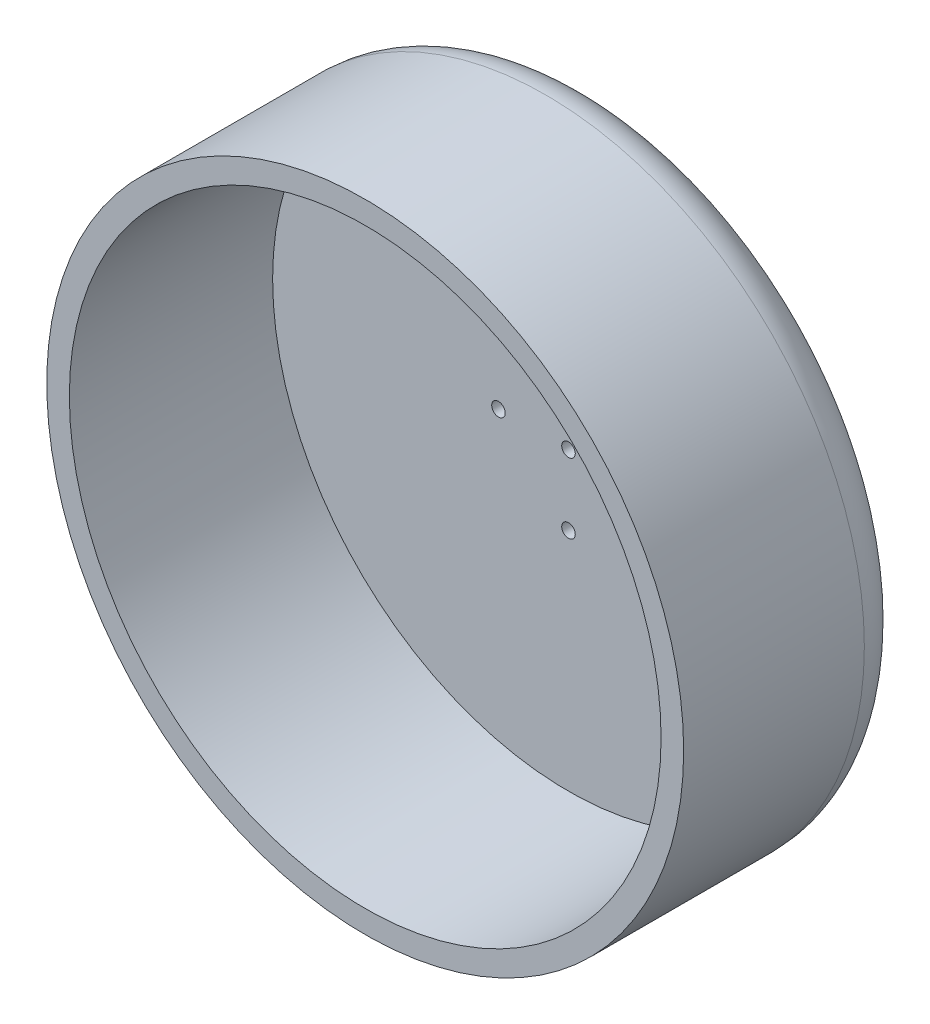
ISO-10303-21;
HEADER;
FILE_DESCRIPTION(('STEP AP214'),'2;1');
FILE_NAME('part.step','',(''),(''),'','','');
FILE_SCHEMA(('AUTOMOTIVE_DESIGN { 1 0 10303 214 1 1 1 1 }'));
ENDSEC;
DATA;
#1=APPLICATION_CONTEXT('core data for automotive mechanical design processes');
#2=APPLICATION_PROTOCOL_DEFINITION('international standard','automotive_design',2000,#1);
#3=PRODUCT_CONTEXT('',#1,'mechanical');
#4=PRODUCT('Part','Part','',(#3));
#5=PRODUCT_RELATED_PRODUCT_CATEGORY('part','',(#4));
#6=PRODUCT_DEFINITION_FORMATION('','',#4);
#7=PRODUCT_DEFINITION_CONTEXT('part definition',#1,'design');
#8=PRODUCT_DEFINITION('design','',#6,#7);
#9=PRODUCT_DEFINITION_SHAPE('','',#8);
#10=(LENGTH_UNIT() NAMED_UNIT(*) SI_UNIT(.MILLI.,.METRE.));
#11=(NAMED_UNIT(*) PLANE_ANGLE_UNIT() SI_UNIT($,.RADIAN.));
#12=(NAMED_UNIT(*) SI_UNIT($,.STERADIAN.) SOLID_ANGLE_UNIT());
#13=UNCERTAINTY_MEASURE_WITH_UNIT(LENGTH_MEASURE(1.E-05),#10,'distance_accuracy_value','');
#14=(GEOMETRIC_REPRESENTATION_CONTEXT(3) GLOBAL_UNCERTAINTY_ASSIGNED_CONTEXT((#13)) GLOBAL_UNIT_ASSIGNED_CONTEXT((#10,
#11,#12)) REPRESENTATION_CONTEXT('',''));
#15=CARTESIAN_POINT('',(0.,0.,0.));
#16=DIRECTION('',(0.,0.,1.));
#17=DIRECTION('',(1.,0.,0.));
#18=AXIS2_PLACEMENT_3D('',#15,#16,#17);
#19=CARTESIAN_POINT('',(0.,0.,5.));
#20=DIRECTION('',(0.,0.,1.));
#21=DIRECTION('',(1.,0.,0.));
#22=AXIS2_PLACEMENT_3D('',#19,#20,#21);
#23=PLANE('',#22);
#24=CARTESIAN_POINT('',(0.,0.,5.));
#25=DIRECTION('',(0.,0.,1.));
#26=DIRECTION('',(1.,0.,0.));
#27=AXIS2_PLACEMENT_3D('',#24,#25,#26);
#28=CIRCLE('',#27,1.5);
#29=CARTESIAN_POINT('',(1.5,0.,5.));
#30=VERTEX_POINT('',#29);
#31=EDGE_CURVE('E69',#30,#30,#28,.T.);
#32=ORIENTED_EDGE('',*,*,#31,.F.);
#33=EDGE_LOOP('',(#32));
#34=FACE_BOUND('',#33,.T.);
#35=CARTESIAN_POINT('',(0.,15.5,5.));
#36=DIRECTION('',(0.,0.,1.));
#37=DIRECTION('',(1.,0.,0.));
#38=AXIS2_PLACEMENT_3D('',#35,#36,#37);
#39=CIRCLE('',#38,1.5);
#40=CARTESIAN_POINT('',(1.5,15.5,5.));
#41=VERTEX_POINT('',#40);
#42=EDGE_CURVE('E97',#41,#41,#39,.T.);
#43=ORIENTED_EDGE('',*,*,#42,.F.);
#44=EDGE_LOOP('',(#43));
#45=FACE_BOUND('',#44,.T.);
#46=CARTESIAN_POINT('',(15.5,0.,5.));
#47=DIRECTION('',(0.,0.,1.));
#48=DIRECTION('',(1.,0.,0.));
#49=AXIS2_PLACEMENT_3D('',#46,#47,#48);
#50=CIRCLE('',#49,1.5);
#51=CARTESIAN_POINT('',(17.,0.,5.));
#52=VERTEX_POINT('',#51);
#53=EDGE_CURVE('E101',#52,#52,#50,.T.);
#54=ORIENTED_EDGE('',*,*,#53,.F.);
#55=EDGE_LOOP('',(#54));
#56=FACE_BOUND('',#55,.T.);
#57=CARTESIAN_POINT('',(-1.08235921504137E-13,-15.5,5.));
#58=DIRECTION('',(0.,0.,1.));
#59=DIRECTION('',(1.,0.,0.));
#60=AXIS2_PLACEMENT_3D('',#57,#58,#59);
#61=CIRCLE('',#60,1.5);
#62=CARTESIAN_POINT('',(1.49999999999989,-15.5,5.));
#63=VERTEX_POINT('',#62);
#64=EDGE_CURVE('E105',#63,#63,#61,.T.);
#65=ORIENTED_EDGE('',*,*,#64,.F.);
#66=EDGE_LOOP('',(#65));
#67=FACE_BOUND('',#66,.T.);
#68=CARTESIAN_POINT('',(-15.5,1.62353882256206E-13,5.));
#69=DIRECTION('',(0.,0.,1.));
#70=DIRECTION('',(1.,0.,0.));
#71=AXIS2_PLACEMENT_3D('',#68,#69,#70);
#72=CIRCLE('',#71,1.5);
#73=CARTESIAN_POINT('',(-14.,1.62353882256206E-13,5.));
#74=VERTEX_POINT('',#73);
#75=EDGE_CURVE('E76',#74,#74,#72,.T.);
#76=ORIENTED_EDGE('',*,*,#75,.F.);
#77=EDGE_LOOP('',(#76));
#78=FACE_BOUND('',#77,.T.);
#79=CARTESIAN_POINT('',(0.,0.,5.));
#80=DIRECTION('',(0.,0.,1.));
#81=DIRECTION('',(1.,0.,0.));
#82=AXIS2_PLACEMENT_3D('',#79,#80,#81);
#83=CIRCLE('',#82,65.5);
#84=CARTESIAN_POINT('',(65.5,0.,5.));
#85=VERTEX_POINT('',#84);
#86=EDGE_CURVE('E64',#85,#85,#83,.F.);
#87=ORIENTED_EDGE('',*,*,#86,.F.);
#88=EDGE_LOOP('',(#87));
#89=FACE_BOUND('',#88,.T.);
#90=ADVANCED_FACE('F51',(#34,#45,#56,#67,#78,#89),#23,.T.);
#91=CARTESIAN_POINT('',(0.,15.5,5.));
#92=DIRECTION('',(0.,0.,-1.));
#93=DIRECTION('',(-1.,0.,0.));
#94=AXIS2_PLACEMENT_3D('',#91,#92,#93);
#95=CYLINDRICAL_SURFACE('',#94,1.5);
#96=ORIENTED_EDGE('',*,*,#42,.T.);
#97=EDGE_LOOP('',(#96));
#98=FACE_BOUND('',#97,.T.);
#99=CARTESIAN_POINT('',(0.,15.5,0.));
#100=DIRECTION('',(0.,0.,1.));
#101=DIRECTION('',(1.,0.,0.));
#102=AXIS2_PLACEMENT_3D('',#99,#100,#101);
#103=CIRCLE('',#102,1.5);
#104=CARTESIAN_POINT('',(1.5,15.5,0.));
#105=VERTEX_POINT('',#104);
#106=EDGE_CURVE('E77',#105,#105,#103,.T.);
#107=ORIENTED_EDGE('',*,*,#106,.F.);
#108=EDGE_LOOP('',(#107));
#109=FACE_BOUND('',#108,.T.);
#110=ADVANCED_FACE('F137',(#98,#109),#95,.F.);
#111=CARTESIAN_POINT('',(15.5,0.,5.));
#112=DIRECTION('',(0.,0.,-1.));
#113=DIRECTION('',(-1.,0.,0.));
#114=AXIS2_PLACEMENT_3D('',#111,#112,#113);
#115=CYLINDRICAL_SURFACE('',#114,1.5);
#116=ORIENTED_EDGE('',*,*,#53,.T.);
#117=EDGE_LOOP('',(#116));
#118=FACE_BOUND('',#117,.T.);
#119=CARTESIAN_POINT('',(15.5,0.,0.));
#120=DIRECTION('',(0.,0.,1.));
#121=DIRECTION('',(1.,0.,0.));
#122=AXIS2_PLACEMENT_3D('',#119,#120,#121);
#123=CIRCLE('',#122,1.5);
#124=CARTESIAN_POINT('',(17.,0.,0.));
#125=VERTEX_POINT('',#124);
#126=EDGE_CURVE('E81',#125,#125,#123,.T.);
#127=ORIENTED_EDGE('',*,*,#126,.F.);
#128=EDGE_LOOP('',(#127));
#129=FACE_BOUND('',#128,.T.);
#130=ADVANCED_FACE('F143',(#118,#129),#115,.F.);
#131=CARTESIAN_POINT('',(-1.08235921504137E-13,-15.5,5.));
#132=DIRECTION('',(0.,0.,-1.));
#133=DIRECTION('',(-1.,0.,0.));
#134=AXIS2_PLACEMENT_3D('',#131,#132,#133);
#135=CYLINDRICAL_SURFACE('',#134,1.5);
#136=ORIENTED_EDGE('',*,*,#64,.T.);
#137=EDGE_LOOP('',(#136));
#138=FACE_BOUND('',#137,.T.);
#139=CARTESIAN_POINT('',(-1.08235921504137E-13,-15.5,0.));
#140=DIRECTION('',(0.,0.,1.));
#141=DIRECTION('',(1.,0.,0.));
#142=AXIS2_PLACEMENT_3D('',#139,#140,#141);
#143=CIRCLE('',#142,1.5);
#144=CARTESIAN_POINT('',(1.49999999999989,-15.5,0.));
#145=VERTEX_POINT('',#144);
#146=EDGE_CURVE('E85',#145,#145,#143,.T.);
#147=ORIENTED_EDGE('',*,*,#146,.F.);
#148=EDGE_LOOP('',(#147));
#149=FACE_BOUND('',#148,.T.);
#150=ADVANCED_FACE('F154',(#138,#149),#135,.F.);
#151=CARTESIAN_POINT('',(-15.5,1.62353882256206E-13,5.));
#152=DIRECTION('',(0.,0.,-1.));
#153=DIRECTION('',(-1.,0.,0.));
#154=AXIS2_PLACEMENT_3D('',#151,#152,#153);
#155=CYLINDRICAL_SURFACE('',#154,1.5);
#156=ORIENTED_EDGE('',*,*,#75,.T.);
#157=EDGE_LOOP('',(#156));
#158=FACE_BOUND('',#157,.T.);
#159=CARTESIAN_POINT('',(-15.5,1.62353882256206E-13,0.));
#160=DIRECTION('',(0.,0.,1.));
#161=DIRECTION('',(1.,0.,0.));
#162=AXIS2_PLACEMENT_3D('',#159,#160,#161);
#163=CIRCLE('',#162,1.5);
#164=CARTESIAN_POINT('',(-14.,1.62353882256206E-13,0.));
#165=VERTEX_POINT('',#164);
#166=EDGE_CURVE('E89',#165,#165,#163,.T.);
#167=ORIENTED_EDGE('',*,*,#166,.F.);
#168=EDGE_LOOP('',(#167));
#169=FACE_BOUND('',#168,.T.);
#170=ADVANCED_FACE('F158',(#158,#169),#155,.F.);
#171=CARTESIAN_POINT('',(0.,0.,5.));
#172=DIRECTION('',(0.,0.,-1.));
#173=DIRECTION('',(-1.,0.,0.));
#174=AXIS2_PLACEMENT_3D('',#171,#172,#173);
#175=CYLINDRICAL_SURFACE('',#174,70.5);
#176=CARTESIAN_POINT('',(0.,0.,10.));
#177=DIRECTION('',(0.,0.,1.));
#178=DIRECTION('',(1.,0.,0.));
#179=AXIS2_PLACEMENT_3D('',#176,#177,#178);
#180=CIRCLE('',#179,70.5);
#181=CARTESIAN_POINT('',(70.5,0.,10.));
#182=VERTEX_POINT('',#181);
#183=EDGE_CURVE('E59',#182,#182,#180,.T.);
#184=ORIENTED_EDGE('',*,*,#183,.T.);
#185=EDGE_LOOP('',(#184));
#186=FACE_BOUND('',#185,.T.);
#187=CARTESIAN_POINT('',(0.,0.,50.));
#188=DIRECTION('',(0.,0.,1.));
#189=DIRECTION('',(1.,0.,0.));
#190=AXIS2_PLACEMENT_3D('',#187,#188,#189);
#191=CIRCLE('',#190,70.5);
#192=CARTESIAN_POINT('',(70.5,0.,50.));
#193=VERTEX_POINT('',#192);
#194=EDGE_CURVE('E93',#193,#193,#191,.T.);
#195=ORIENTED_EDGE('',*,*,#194,.F.);
#196=EDGE_LOOP('',(#195));
#197=FACE_BOUND('',#196,.T.);
#198=ADVANCED_FACE('F149',(#186,#197),#175,.T.);
#199=CARTESIAN_POINT('',(0.,0.,5.));
#200=DIRECTION('',(0.,0.,-1.));
#201=DIRECTION('',(-1.,0.,0.));
#202=AXIS2_PLACEMENT_3D('',#199,#200,#201);
#203=CYLINDRICAL_SURFACE('',#202,1.5);
#204=ORIENTED_EDGE('',*,*,#31,.T.);
#205=EDGE_LOOP('',(#204));
#206=FACE_BOUND('',#205,.T.);
#207=CARTESIAN_POINT('',(0.,0.,0.));
#208=DIRECTION('',(0.,0.,1.));
#209=DIRECTION('',(1.,0.,0.));
#210=AXIS2_PLACEMENT_3D('',#207,#208,#209);
#211=CIRCLE('',#210,1.5);
#212=CARTESIAN_POINT('',(1.5,0.,0.));
#213=VERTEX_POINT('',#212);
#214=EDGE_CURVE('E72',#213,#213,#211,.T.);
#215=ORIENTED_EDGE('',*,*,#214,.F.);
#216=EDGE_LOOP('',(#215));
#217=FACE_BOUND('',#216,.T.);
#218=ADVANCED_FACE('F134',(#206,#217),#203,.F.);
#219=CARTESIAN_POINT('',(0.,0.,0.));
#220=DIRECTION('',(0.,0.,1.));
#221=DIRECTION('',(1.,0.,0.));
#222=AXIS2_PLACEMENT_3D('',#219,#220,#221);
#223=PLANE('',#222);
#224=CARTESIAN_POINT('',(0.,0.,0.));
#225=DIRECTION('',(0.,0.,1.));
#226=DIRECTION('',(1.,0.,0.));
#227=AXIS2_PLACEMENT_3D('',#224,#225,#226);
#228=CIRCLE('',#227,60.5);
#229=CARTESIAN_POINT('',(60.5,0.,0.));
#230=VERTEX_POINT('',#229);
#231=EDGE_CURVE('E11',#230,#230,#228,.F.);
#232=ORIENTED_EDGE('',*,*,#231,.T.);
#233=EDGE_LOOP('',(#232));
#234=FACE_BOUND('',#233,.T.);
#235=ORIENTED_EDGE('',*,*,#214,.T.);
#236=EDGE_LOOP('',(#235));
#237=FACE_BOUND('',#236,.T.);
#238=ORIENTED_EDGE('',*,*,#106,.T.);
#239=EDGE_LOOP('',(#238));
#240=FACE_BOUND('',#239,.T.);
#241=ORIENTED_EDGE('',*,*,#126,.T.);
#242=EDGE_LOOP('',(#241));
#243=FACE_BOUND('',#242,.T.);
#244=ORIENTED_EDGE('',*,*,#146,.T.);
#245=EDGE_LOOP('',(#244));
#246=FACE_BOUND('',#245,.T.);
#247=ORIENTED_EDGE('',*,*,#166,.T.);
#248=EDGE_LOOP('',(#247));
#249=FACE_BOUND('',#248,.T.);
#250=ADVANCED_FACE('F124',(#234,#237,#240,#243,#246,#249),#223,.F.);
#251=CARTESIAN_POINT('',(0.,0.,50.));
#252=DIRECTION('',(0.,0.,1.));
#253=DIRECTION('',(1.,0.,0.));
#254=AXIS2_PLACEMENT_3D('',#251,#252,#253);
#255=PLANE('',#254);
#256=ORIENTED_EDGE('',*,*,#194,.T.);
#257=EDGE_LOOP('',(#256));
#258=FACE_BOUND('',#257,.T.);
#259=CARTESIAN_POINT('',(0.,0.,50.));
#260=DIRECTION('',(0.,0.,1.));
#261=DIRECTION('',(1.,0.,0.));
#262=AXIS2_PLACEMENT_3D('',#259,#260,#261);
#263=CIRCLE('',#262,65.5);
#264=CARTESIAN_POINT('',(65.5,0.,50.));
#265=VERTEX_POINT('',#264);
#266=EDGE_CURVE('E115',#265,#265,#263,.T.);
#267=ORIENTED_EDGE('',*,*,#266,.F.);
#268=EDGE_LOOP('',(#267));
#269=FACE_BOUND('',#268,.T.);
#270=ADVANCED_FACE('F122',(#258,#269),#255,.T.);
#271=CARTESIAN_POINT('',(0.,0.,50.));
#272=DIRECTION('',(0.,0.,-1.));
#273=DIRECTION('',(-1.,0.,0.));
#274=AXIS2_PLACEMENT_3D('',#271,#272,#273);
#275=CYLINDRICAL_SURFACE('',#274,65.5);
#276=ORIENTED_EDGE('',*,*,#86,.T.);
#277=EDGE_LOOP('',(#276));
#278=FACE_BOUND('',#277,.T.);
#279=ORIENTED_EDGE('',*,*,#266,.T.);
#280=EDGE_LOOP('',(#279));
#281=FACE_BOUND('',#280,.T.);
#282=ADVANCED_FACE('F120',(#278,#281),#275,.F.);
#283=CARTESIAN_POINT('',(0.,0.,10.));
#284=DIRECTION('',(0.,0.,1.));
#285=DIRECTION('',(1.,0.,0.));
#286=AXIS2_PLACEMENT_3D('',#283,#284,#285);
#287=TOROIDAL_SURFACE('',#286,60.5,10.);
#288=ORIENTED_EDGE('',*,*,#231,.F.);
#289=EDGE_LOOP('',(#288));
#290=FACE_BOUND('',#289,.T.);
#291=ORIENTED_EDGE('',*,*,#183,.F.);
#292=EDGE_LOOP('',(#291));
#293=FACE_BOUND('',#292,.T.);
#294=ADVANCED_FACE('F53',(#290,#293),#287,.T.);
#295=CLOSED_SHELL('',(#90,#110,#130,#150,#170,#198,#218,#250,#270,#282,#294));
#296=MANIFOLD_SOLID_BREP('B2',#295);
#297=ADVANCED_BREP_SHAPE_REPRESENTATION('',(#18,#296),#14);
#298=SHAPE_DEFINITION_REPRESENTATION(#9,#297);
ENDSEC;
END-ISO-10303-21;
